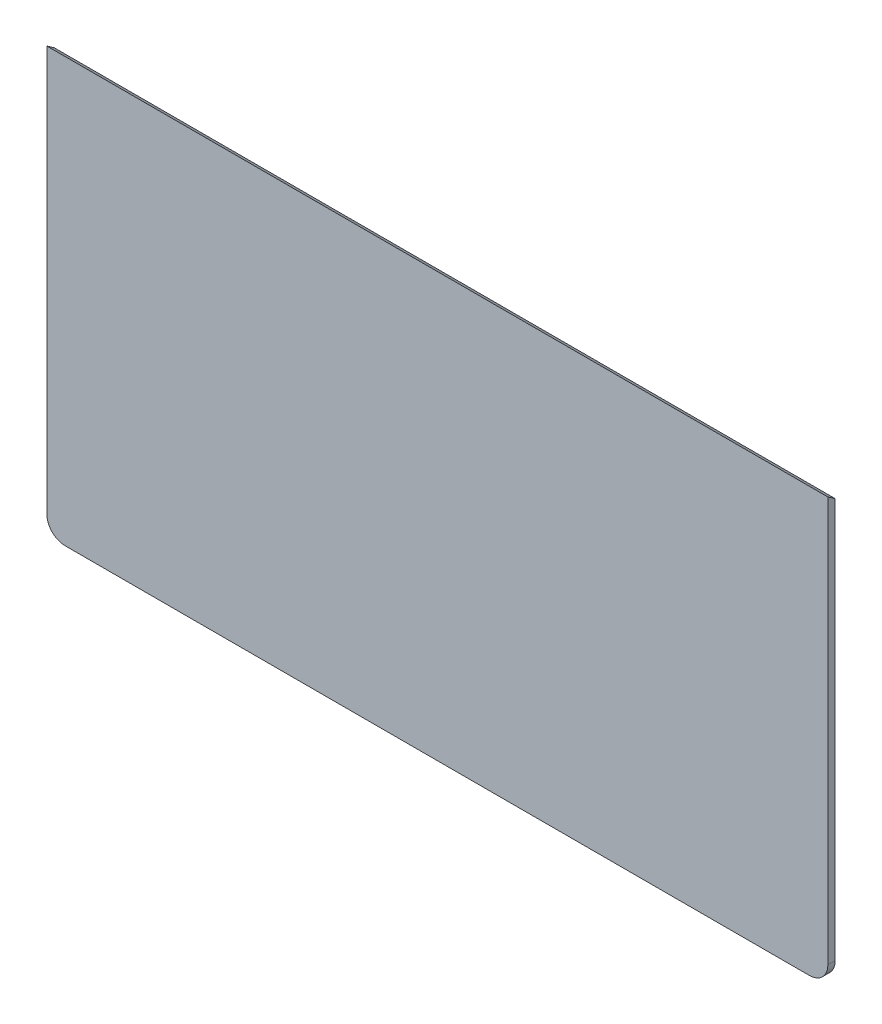
ISO-10303-21;
HEADER;
FILE_DESCRIPTION(('STEP AP214'),'2;1');
FILE_NAME('part.step','',(''),(''),'','','');
FILE_SCHEMA(('AUTOMOTIVE_DESIGN { 1 0 10303 214 1 1 1 1 }'));
ENDSEC;
DATA;
#1=APPLICATION_CONTEXT('core data for automotive mechanical design processes');
#2=APPLICATION_PROTOCOL_DEFINITION('international standard','automotive_design',2000,#1);
#3=PRODUCT_CONTEXT('',#1,'mechanical');
#4=PRODUCT('Part','Part','',(#3));
#5=PRODUCT_RELATED_PRODUCT_CATEGORY('part','',(#4));
#6=PRODUCT_DEFINITION_FORMATION('','',#4);
#7=PRODUCT_DEFINITION_CONTEXT('part definition',#1,'design');
#8=PRODUCT_DEFINITION('design','',#6,#7);
#9=PRODUCT_DEFINITION_SHAPE('','',#8);
#10=(LENGTH_UNIT() NAMED_UNIT(*) SI_UNIT(.MILLI.,.METRE.));
#11=(NAMED_UNIT(*) PLANE_ANGLE_UNIT() SI_UNIT($,.RADIAN.));
#12=(NAMED_UNIT(*) SI_UNIT($,.STERADIAN.) SOLID_ANGLE_UNIT());
#13=UNCERTAINTY_MEASURE_WITH_UNIT(LENGTH_MEASURE(1.E-05),#10,'distance_accuracy_value','');
#14=(GEOMETRIC_REPRESENTATION_CONTEXT(3) GLOBAL_UNCERTAINTY_ASSIGNED_CONTEXT((#13)) GLOBAL_UNIT_ASSIGNED_CONTEXT((#10,
#11,#12)) REPRESENTATION_CONTEXT('',''));
#15=CARTESIAN_POINT('',(0.,0.,0.));
#16=DIRECTION('',(0.,0.,1.));
#17=DIRECTION('',(1.,0.,0.));
#18=AXIS2_PLACEMENT_3D('',#15,#16,#17);
#19=CARTESIAN_POINT('',(212.,-115.,4.));
#20=DIRECTION('',(-1.,0.,0.));
#21=DIRECTION('',(0.,0.,1.));
#22=AXIS2_PLACEMENT_3D('',#19,#20,#21);
#23=PLANE('',#22);
#24=DIRECTION('',(0.,1.,0.));
#25=VECTOR('',#24,1.);
#26=CARTESIAN_POINT('',(212.,-115.,0.));
#27=LINE('',#26,#25);
#28=CARTESIAN_POINT('',(212.,-105.,0.));
#29=VERTEX_POINT('',#28);
#30=CARTESIAN_POINT('',(212.,112.199169847161,0.));
#31=VERTEX_POINT('',#30);
#32=EDGE_CURVE('E114',#29,#31,#27,.T.);
#33=ORIENTED_EDGE('',*,*,#32,.T.);
#34=DIRECTION('',(0.,-0.573576436351031,-0.819152044289002));
#35=VECTOR('',#34,1.);
#36=CARTESIAN_POINT('',(212.,115.,4.));
#37=LINE('',#36,#35);
#38=CARTESIAN_POINT('',(212.,115.,4.));
#39=VERTEX_POINT('',#38);
#40=EDGE_CURVE('E56',#39,#31,#37,.T.);
#41=ORIENTED_EDGE('',*,*,#40,.F.);
#42=DIRECTION('',(0.,1.,0.));
#43=VECTOR('',#42,1.);
#44=CARTESIAN_POINT('',(212.,-115.,4.));
#45=LINE('',#44,#43);
#46=CARTESIAN_POINT('',(212.,-105.,4.));
#47=VERTEX_POINT('',#46);
#48=EDGE_CURVE('E105',#47,#39,#45,.T.);
#49=ORIENTED_EDGE('',*,*,#48,.F.);
#50=DIRECTION('',(0.,0.,-1.));
#51=VECTOR('',#50,1.);
#52=CARTESIAN_POINT('',(212.,-105.,4.));
#53=LINE('',#52,#51);
#54=EDGE_CURVE('E110',#47,#29,#53,.T.);
#55=ORIENTED_EDGE('',*,*,#54,.T.);
#56=EDGE_LOOP('',(#33,#41,#49,#55));
#57=FACE_BOUND('',#56,.T.);
#58=ADVANCED_FACE('F41',(#57),#23,.F.);
#59=CARTESIAN_POINT('',(-212.,-115.,4.));
#60=DIRECTION('',(1.,0.,0.));
#61=DIRECTION('',(0.,0.,-1.));
#62=AXIS2_PLACEMENT_3D('',#59,#60,#61);
#63=PLANE('',#62);
#64=DIRECTION('',(0.,-1.,0.));
#65=VECTOR('',#64,1.);
#66=CARTESIAN_POINT('',(-212.,-115.,4.));
#67=LINE('',#66,#65);
#68=CARTESIAN_POINT('',(-212.,115.,4.));
#69=VERTEX_POINT('',#68);
#70=CARTESIAN_POINT('',(-212.,-105.,4.));
#71=VERTEX_POINT('',#70);
#72=EDGE_CURVE('E102',#69,#71,#67,.T.);
#73=ORIENTED_EDGE('',*,*,#72,.F.);
#74=DIRECTION('',(0.,-0.573576436351031,-0.819152044289002));
#75=VECTOR('',#74,1.);
#76=CARTESIAN_POINT('',(-212.,115.,4.));
#77=LINE('',#76,#75);
#78=CARTESIAN_POINT('',(-212.,112.199169847161,0.));
#79=VERTEX_POINT('',#78);
#80=EDGE_CURVE('E91',#69,#79,#77,.T.);
#81=ORIENTED_EDGE('',*,*,#80,.T.);
#82=DIRECTION('',(0.,-1.,0.));
#83=VECTOR('',#82,1.);
#84=CARTESIAN_POINT('',(-212.,-115.,0.));
#85=LINE('',#84,#83);
#86=CARTESIAN_POINT('',(-212.,-105.,0.));
#87=VERTEX_POINT('',#86);
#88=EDGE_CURVE('E117',#79,#87,#85,.T.);
#89=ORIENTED_EDGE('',*,*,#88,.T.);
#90=DIRECTION('',(0.,0.,-1.));
#91=VECTOR('',#90,1.);
#92=CARTESIAN_POINT('',(-212.,-105.,4.));
#93=LINE('',#92,#91);
#94=EDGE_CURVE('E11',#87,#71,#93,.F.);
#95=ORIENTED_EDGE('',*,*,#94,.T.);
#96=EDGE_LOOP('',(#73,#81,#89,#95));
#97=FACE_BOUND('',#96,.T.);
#98=ADVANCED_FACE('F107',(#97),#63,.F.);
#99=CARTESIAN_POINT('',(-212.,-115.,4.));
#100=DIRECTION('',(0.,1.,0.));
#101=DIRECTION('',(0.,0.,1.));
#102=AXIS2_PLACEMENT_3D('',#99,#100,#101);
#103=PLANE('',#102);
#104=DIRECTION('',(1.,0.,0.));
#105=VECTOR('',#104,1.);
#106=CARTESIAN_POINT('',(-212.,-115.,0.));
#107=LINE('',#106,#105);
#108=CARTESIAN_POINT('',(-202.,-115.,0.));
#109=VERTEX_POINT('',#108);
#110=CARTESIAN_POINT('',(202.,-115.,0.));
#111=VERTEX_POINT('',#110);
#112=EDGE_CURVE('E119',#109,#111,#107,.T.);
#113=ORIENTED_EDGE('',*,*,#112,.T.);
#114=DIRECTION('',(0.,0.,-1.));
#115=VECTOR('',#114,1.);
#116=CARTESIAN_POINT('',(202.,-115.,4.));
#117=LINE('',#116,#115);
#118=CARTESIAN_POINT('',(202.,-115.,4.));
#119=VERTEX_POINT('',#118);
#120=EDGE_CURVE('E132',#111,#119,#117,.F.);
#121=ORIENTED_EDGE('',*,*,#120,.T.);
#122=DIRECTION('',(1.,0.,0.));
#123=VECTOR('',#122,1.);
#124=CARTESIAN_POINT('',(-212.,-115.,4.));
#125=LINE('',#124,#123);
#126=CARTESIAN_POINT('',(-202.,-115.,4.));
#127=VERTEX_POINT('',#126);
#128=EDGE_CURVE('E108',#127,#119,#125,.T.);
#129=ORIENTED_EDGE('',*,*,#128,.F.);
#130=DIRECTION('',(0.,0.,-1.));
#131=VECTOR('',#130,1.);
#132=CARTESIAN_POINT('',(-202.,-115.,4.));
#133=LINE('',#132,#131);
#134=EDGE_CURVE('E129',#127,#109,#133,.T.);
#135=ORIENTED_EDGE('',*,*,#134,.T.);
#136=EDGE_LOOP('',(#113,#121,#129,#135));
#137=FACE_BOUND('',#136,.T.);
#138=ADVANCED_FACE('F147',(#137),#103,.F.);
#139=CARTESIAN_POINT('',(0.,0.,4.));
#140=DIRECTION('',(0.,0.,-1.));
#141=DIRECTION('',(-1.,0.,0.));
#142=AXIS2_PLACEMENT_3D('',#139,#140,#141);
#143=PLANE('',#142);
#144=ORIENTED_EDGE('',*,*,#128,.T.);
#145=CARTESIAN_POINT('',(202.,-105.,4.));
#146=DIRECTION('',(0.,0.,-1.));
#147=DIRECTION('',(-1.,0.,0.));
#148=AXIS2_PLACEMENT_3D('',#145,#146,#147);
#149=CIRCLE('',#148,10.);
#150=EDGE_CURVE('E49',#119,#47,#149,.F.);
#151=ORIENTED_EDGE('',*,*,#150,.T.);
#152=ORIENTED_EDGE('',*,*,#48,.T.);
#153=DIRECTION('',(-1.,0.,0.));
#154=VECTOR('',#153,1.);
#155=CARTESIAN_POINT('',(-212.,115.,4.));
#156=LINE('',#155,#154);
#157=EDGE_CURVE('E94',#39,#69,#156,.T.);
#158=ORIENTED_EDGE('',*,*,#157,.T.);
#159=ORIENTED_EDGE('',*,*,#72,.T.);
#160=CARTESIAN_POINT('',(-202.,-105.,4.));
#161=DIRECTION('',(0.,0.,-1.));
#162=DIRECTION('',(-1.,0.,0.));
#163=AXIS2_PLACEMENT_3D('',#160,#161,#162);
#164=CIRCLE('',#163,10.);
#165=EDGE_CURVE('E134',#71,#127,#164,.F.);
#166=ORIENTED_EDGE('',*,*,#165,.T.);
#167=EDGE_LOOP('',(#144,#151,#152,#158,#159,#166));
#168=FACE_BOUND('',#167,.T.);
#169=ADVANCED_FACE('F101',(#168),#143,.F.);
#170=CARTESIAN_POINT('',(0.,0.,0.));
#171=DIRECTION('',(0.,0.,-1.));
#172=DIRECTION('',(-1.,0.,0.));
#173=AXIS2_PLACEMENT_3D('',#170,#171,#172);
#174=PLANE('',#173);
#175=DIRECTION('',(1.,0.,0.));
#176=VECTOR('',#175,1.);
#177=CARTESIAN_POINT('',(-212.,112.199169847161,0.));
#178=LINE('',#177,#176);
#179=EDGE_CURVE('E95',#79,#31,#178,.T.);
#180=ORIENTED_EDGE('',*,*,#179,.T.);
#181=ORIENTED_EDGE('',*,*,#32,.F.);
#182=CARTESIAN_POINT('',(202.,-105.,0.));
#183=DIRECTION('',(0.,0.,-1.));
#184=DIRECTION('',(-1.,0.,0.));
#185=AXIS2_PLACEMENT_3D('',#182,#183,#184);
#186=CIRCLE('',#185,10.);
#187=EDGE_CURVE('E127',#29,#111,#186,.T.);
#188=ORIENTED_EDGE('',*,*,#187,.T.);
#189=ORIENTED_EDGE('',*,*,#112,.F.);
#190=CARTESIAN_POINT('',(-202.,-105.,0.));
#191=DIRECTION('',(0.,0.,-1.));
#192=DIRECTION('',(-1.,0.,0.));
#193=AXIS2_PLACEMENT_3D('',#190,#191,#192);
#194=CIRCLE('',#193,10.);
#195=EDGE_CURVE('E124',#109,#87,#194,.T.);
#196=ORIENTED_EDGE('',*,*,#195,.T.);
#197=ORIENTED_EDGE('',*,*,#88,.F.);
#198=EDGE_LOOP('',(#180,#181,#188,#189,#196,#197));
#199=FACE_BOUND('',#198,.T.);
#200=ADVANCED_FACE('F145',(#199),#174,.T.);
#201=CARTESIAN_POINT('',(202.,-105.,4.));
#202=DIRECTION('',(0.,0.,-1.));
#203=DIRECTION('',(-1.,0.,0.));
#204=AXIS2_PLACEMENT_3D('',#201,#202,#203);
#205=CYLINDRICAL_SURFACE('',#204,10.);
#206=ORIENTED_EDGE('',*,*,#150,.F.);
#207=ORIENTED_EDGE('',*,*,#120,.F.);
#208=ORIENTED_EDGE('',*,*,#187,.F.);
#209=ORIENTED_EDGE('',*,*,#54,.F.);
#210=EDGE_LOOP('',(#206,#207,#208,#209));
#211=FACE_BOUND('',#210,.T.);
#212=ADVANCED_FACE('F142',(#211),#205,.T.);
#213=CARTESIAN_POINT('',(-202.,-105.,4.));
#214=DIRECTION('',(0.,0.,-1.));
#215=DIRECTION('',(-1.,0.,0.));
#216=AXIS2_PLACEMENT_3D('',#213,#214,#215);
#217=CYLINDRICAL_SURFACE('',#216,10.);
#218=ORIENTED_EDGE('',*,*,#165,.F.);
#219=ORIENTED_EDGE('',*,*,#94,.F.);
#220=ORIENTED_EDGE('',*,*,#195,.F.);
#221=ORIENTED_EDGE('',*,*,#134,.F.);
#222=EDGE_LOOP('',(#218,#219,#220,#221));
#223=FACE_BOUND('',#222,.T.);
#224=ADVANCED_FACE('F43',(#223),#217,.T.);
#225=CARTESIAN_POINT('',(-212.,115.,4.));
#226=DIRECTION('',(0.,-0.819152044289002,0.573576436351031));
#227=DIRECTION('',(0.,-0.573576436351031,-0.819152044289002));
#228=AXIS2_PLACEMENT_3D('',#225,#226,#227);
#229=PLANE('',#228);
#230=ORIENTED_EDGE('',*,*,#40,.T.);
#231=ORIENTED_EDGE('',*,*,#179,.F.);
#232=ORIENTED_EDGE('',*,*,#80,.F.);
#233=ORIENTED_EDGE('',*,*,#157,.F.);
#234=EDGE_LOOP('',(#230,#231,#232,#233));
#235=FACE_BOUND('',#234,.T.);
#236=ADVANCED_FACE('F93',(#235),#229,.F.);
#237=CLOSED_SHELL('',(#58,#98,#138,#169,#200,#212,#224,#236));
#238=MANIFOLD_SOLID_BREP('B2',#237);
#239=ADVANCED_BREP_SHAPE_REPRESENTATION('',(#18,#238),#14);
#240=SHAPE_DEFINITION_REPRESENTATION(#9,#239);
ENDSEC;
END-ISO-10303-21;
